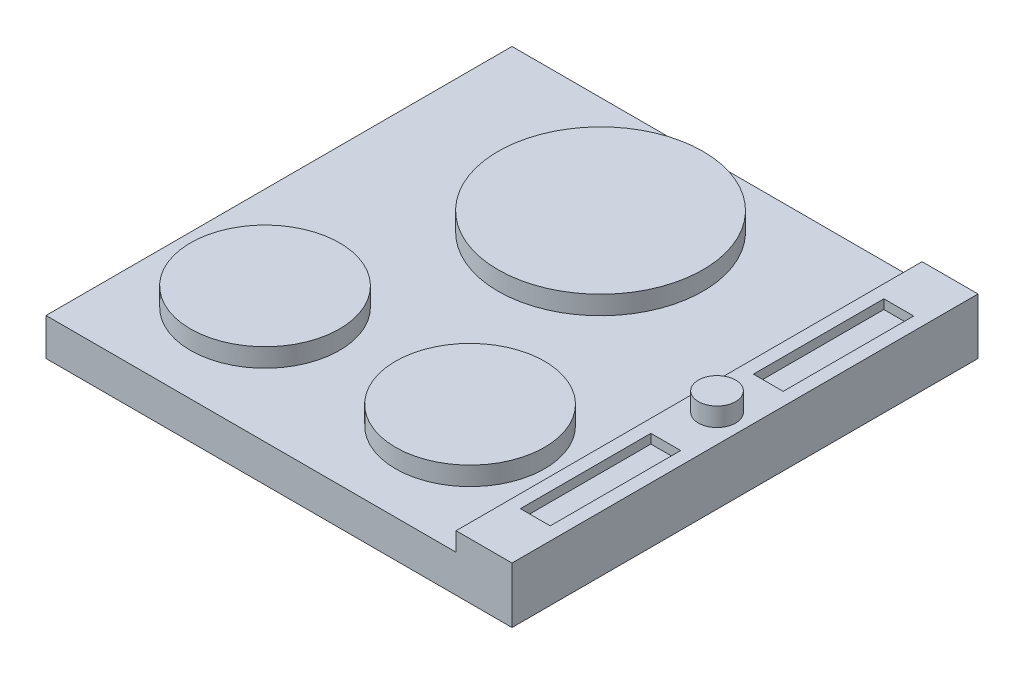
ISO-10303-21;
HEADER;
FILE_DESCRIPTION(('STEP AP214'),'2;1');
FILE_NAME('part.step','',(''),(''),'','','');
FILE_SCHEMA(('AUTOMOTIVE_DESIGN { 1 0 10303 214 1 1 1 1 }'));
ENDSEC;
DATA;
#1=APPLICATION_CONTEXT('core data for automotive mechanical design processes');
#2=APPLICATION_PROTOCOL_DEFINITION('international standard','automotive_design',2000,#1);
#3=PRODUCT_CONTEXT('',#1,'mechanical');
#4=PRODUCT('Part','Part','',(#3));
#5=PRODUCT_RELATED_PRODUCT_CATEGORY('part','',(#4));
#6=PRODUCT_DEFINITION_FORMATION('','',#4);
#7=PRODUCT_DEFINITION_CONTEXT('part definition',#1,'design');
#8=PRODUCT_DEFINITION('design','',#6,#7);
#9=PRODUCT_DEFINITION_SHAPE('','',#8);
#10=(LENGTH_UNIT() NAMED_UNIT(*) SI_UNIT(.MILLI.,.METRE.));
#11=(NAMED_UNIT(*) PLANE_ANGLE_UNIT() SI_UNIT($,.RADIAN.));
#12=(NAMED_UNIT(*) SI_UNIT($,.STERADIAN.) SOLID_ANGLE_UNIT());
#13=UNCERTAINTY_MEASURE_WITH_UNIT(LENGTH_MEASURE(1.E-05),#10,'distance_accuracy_value','');
#14=(GEOMETRIC_REPRESENTATION_CONTEXT(3) GLOBAL_UNCERTAINTY_ASSIGNED_CONTEXT((#13)) GLOBAL_UNIT_ASSIGNED_CONTEXT((#10,
#11,#12)) REPRESENTATION_CONTEXT('',''));
#15=CARTESIAN_POINT('',(0.,0.,0.));
#16=DIRECTION('',(0.,0.,1.));
#17=DIRECTION('',(1.,0.,0.));
#18=AXIS2_PLACEMENT_3D('',#15,#16,#17);
#19=CARTESIAN_POINT('',(-43.75,34.,34.));
#20=DIRECTION('',(1.,0.,0.));
#21=DIRECTION('',(0.,0.,-1.));
#22=AXIS2_PLACEMENT_3D('',#19,#20,#21);
#23=PLANE('',#22);
#24=DIRECTION('',(0.,0.,1.));
#25=VECTOR('',#24,1.);
#26=CARTESIAN_POINT('',(-43.75,32.,34.));
#27=LINE('',#26,#25);
#28=CARTESIAN_POINT('',(-43.75,32.,34.));
#29=VERTEX_POINT('',#28);
#30=CARTESIAN_POINT('',(-43.75,32.,59.));
#31=VERTEX_POINT('',#30);
#32=EDGE_CURVE('E246',#29,#31,#27,.T.);
#33=ORIENTED_EDGE('',*,*,#32,.T.);
#34=DIRECTION('',(0.,-1.,0.));
#35=VECTOR('',#34,1.);
#36=CARTESIAN_POINT('',(-43.75,34.,59.));
#37=LINE('',#36,#35);
#38=CARTESIAN_POINT('',(-43.75,34.,59.));
#39=VERTEX_POINT('',#38);
#40=EDGE_CURVE('E45',#39,#31,#37,.T.);
#41=ORIENTED_EDGE('',*,*,#40,.F.);
#42=DIRECTION('',(0.,0.,1.));
#43=VECTOR('',#42,1.);
#44=CARTESIAN_POINT('',(-43.75,34.,34.));
#45=LINE('',#44,#43);
#46=CARTESIAN_POINT('',(-43.75,34.,34.));
#47=VERTEX_POINT('',#46);
#48=EDGE_CURVE('E247',#47,#39,#45,.T.);
#49=ORIENTED_EDGE('',*,*,#48,.F.);
#50=DIRECTION('',(0.,-1.,0.));
#51=VECTOR('',#50,1.);
#52=CARTESIAN_POINT('',(-43.75,34.,34.));
#53=LINE('',#52,#51);
#54=EDGE_CURVE('E255',#47,#29,#53,.T.);
#55=ORIENTED_EDGE('',*,*,#54,.T.);
#56=EDGE_LOOP('',(#33,#41,#49,#55));
#57=FACE_BOUND('',#56,.T.);
#58=ADVANCED_FACE('F38',(#57),#23,.F.);
#59=CARTESIAN_POINT('',(-43.75,34.,59.));
#60=DIRECTION('',(0.,0.,-1.));
#61=DIRECTION('',(-1.,0.,0.));
#62=AXIS2_PLACEMENT_3D('',#59,#60,#61);
#63=PLANE('',#62);
#64=DIRECTION('',(1.,0.,0.));
#65=VECTOR('',#64,1.);
#66=CARTESIAN_POINT('',(-43.75,32.,59.));
#67=LINE('',#66,#65);
#68=CARTESIAN_POINT('',(-18.75,32.,59.));
#69=VERTEX_POINT('',#68);
#70=EDGE_CURVE('E258',#31,#69,#67,.T.);
#71=ORIENTED_EDGE('',*,*,#70,.T.);
#72=DIRECTION('',(0.,-1.,0.));
#73=VECTOR('',#72,1.);
#74=CARTESIAN_POINT('',(-18.75,34.,59.));
#75=LINE('',#74,#73);
#76=CARTESIAN_POINT('',(-18.75,35.,59.));
#77=VERTEX_POINT('',#76);
#78=EDGE_CURVE('E268',#77,#69,#75,.T.);
#79=ORIENTED_EDGE('',*,*,#78,.F.);
#80=DIRECTION('',(1.,0.,0.));
#81=VECTOR('',#80,1.);
#82=CARTESIAN_POINT('',(-18.75,35.,59.));
#83=LINE('',#82,#81);
#84=CARTESIAN_POINT('',(-21.75,35.,59.));
#85=VERTEX_POINT('',#84);
#86=EDGE_CURVE('E235',#85,#77,#83,.T.);
#87=ORIENTED_EDGE('',*,*,#86,.F.);
#88=DIRECTION('',(0.,-1.,0.));
#89=VECTOR('',#88,1.);
#90=CARTESIAN_POINT('',(-21.75,35.,59.));
#91=LINE('',#90,#89);
#92=CARTESIAN_POINT('',(-21.75,34.,59.));
#93=VERTEX_POINT('',#92);
#94=EDGE_CURVE('E238',#85,#93,#91,.T.);
#95=ORIENTED_EDGE('',*,*,#94,.T.);
#96=DIRECTION('',(1.,0.,0.));
#97=VECTOR('',#96,1.);
#98=CARTESIAN_POINT('',(-43.75,34.,59.));
#99=LINE('',#98,#97);
#100=EDGE_CURVE('E250',#39,#93,#99,.T.);
#101=ORIENTED_EDGE('',*,*,#100,.F.);
#102=ORIENTED_EDGE('',*,*,#40,.T.);
#103=EDGE_LOOP('',(#71,#79,#87,#95,#101,#102));
#104=FACE_BOUND('',#103,.T.);
#105=ADVANCED_FACE('F273',(#104),#63,.F.);
#106=CARTESIAN_POINT('',(-18.75,34.,34.));
#107=DIRECTION('',(-1.,0.,0.));
#108=DIRECTION('',(0.,0.,1.));
#109=AXIS2_PLACEMENT_3D('',#106,#107,#108);
#110=PLANE('',#109);
#111=DIRECTION('',(0.,0.,-1.));
#112=VECTOR('',#111,1.);
#113=CARTESIAN_POINT('',(-18.75,32.,34.));
#114=LINE('',#113,#112);
#115=CARTESIAN_POINT('',(-18.75,32.,34.));
#116=VERTEX_POINT('',#115);
#117=EDGE_CURVE('E260',#69,#116,#114,.T.);
#118=ORIENTED_EDGE('',*,*,#117,.T.);
#119=DIRECTION('',(0.,-1.,0.));
#120=VECTOR('',#119,1.);
#121=CARTESIAN_POINT('',(-18.75,34.,34.));
#122=LINE('',#121,#120);
#123=CARTESIAN_POINT('',(-18.75,35.,34.));
#124=VERTEX_POINT('',#123);
#125=EDGE_CURVE('E265',#124,#116,#122,.T.);
#126=ORIENTED_EDGE('',*,*,#125,.F.);
#127=DIRECTION('',(0.,0.,-1.));
#128=VECTOR('',#127,1.);
#129=CARTESIAN_POINT('',(-18.75,35.,34.));
#130=LINE('',#129,#128);
#131=EDGE_CURVE('E228',#77,#124,#130,.T.);
#132=ORIENTED_EDGE('',*,*,#131,.F.);
#133=ORIENTED_EDGE('',*,*,#78,.T.);
#134=EDGE_LOOP('',(#118,#126,#132,#133));
#135=FACE_BOUND('',#134,.T.);
#136=ADVANCED_FACE('F283',(#135),#110,.F.);
#137=CARTESIAN_POINT('',(-43.75,34.,34.));
#138=DIRECTION('',(0.,0.,1.));
#139=DIRECTION('',(1.,0.,0.));
#140=AXIS2_PLACEMENT_3D('',#137,#138,#139);
#141=PLANE('',#140);
#142=DIRECTION('',(-1.,0.,0.));
#143=VECTOR('',#142,1.);
#144=CARTESIAN_POINT('',(-43.75,32.,34.));
#145=LINE('',#144,#143);
#146=EDGE_CURVE('E251',#116,#29,#145,.T.);
#147=ORIENTED_EDGE('',*,*,#146,.T.);
#148=ORIENTED_EDGE('',*,*,#54,.F.);
#149=DIRECTION('',(-1.,0.,0.));
#150=VECTOR('',#149,1.);
#151=CARTESIAN_POINT('',(-43.75,34.,34.));
#152=LINE('',#151,#150);
#153=CARTESIAN_POINT('',(-21.75,34.,34.));
#154=VERTEX_POINT('',#153);
#155=EDGE_CURVE('E253',#154,#47,#152,.T.);
#156=ORIENTED_EDGE('',*,*,#155,.F.);
#157=DIRECTION('',(0.,-1.,0.));
#158=VECTOR('',#157,1.);
#159=CARTESIAN_POINT('',(-21.75,35.,34.));
#160=LINE('',#159,#158);
#161=CARTESIAN_POINT('',(-21.75,35.,34.));
#162=VERTEX_POINT('',#161);
#163=EDGE_CURVE('E243',#162,#154,#160,.T.);
#164=ORIENTED_EDGE('',*,*,#163,.F.);
#165=DIRECTION('',(-1.,0.,0.));
#166=VECTOR('',#165,1.);
#167=CARTESIAN_POINT('',(-18.75,35.,34.));
#168=LINE('',#167,#166);
#169=EDGE_CURVE('E231',#124,#162,#168,.T.);
#170=ORIENTED_EDGE('',*,*,#169,.F.);
#171=ORIENTED_EDGE('',*,*,#125,.T.);
#172=EDGE_LOOP('',(#147,#148,#156,#164,#170,#171));
#173=FACE_BOUND('',#172,.T.);
#174=ADVANCED_FACE('F287',(#173),#141,.F.);
#175=CARTESIAN_POINT('',(0.,34.,0.));
#176=DIRECTION('',(0.,1.,0.));
#177=DIRECTION('',(0.,0.,1.));
#178=AXIS2_PLACEMENT_3D('',#175,#176,#177);
#179=PLANE('',#178);
#180=CARTESIAN_POINT('',(-32.75,34.,40.25));
#181=DIRECTION('',(0.,1.,0.));
#182=DIRECTION('',(0.,0.,1.));
#183=AXIS2_PLACEMENT_3D('',#180,#181,#182);
#184=CIRCLE('',#183,5.5);
#185=CARTESIAN_POINT('',(-32.75,34.,45.75));
#186=VERTEX_POINT('',#185);
#187=EDGE_CURVE('E210',#186,#186,#184,.T.);
#188=ORIENTED_EDGE('',*,*,#187,.F.);
#189=EDGE_LOOP('',(#188));
#190=FACE_BOUND('',#189,.T.);
#191=CARTESIAN_POINT('',(-27.25,34.,52.75));
#192=DIRECTION('',(0.,1.,0.));
#193=DIRECTION('',(0.,0.,1.));
#194=AXIS2_PLACEMENT_3D('',#191,#192,#193);
#195=CIRCLE('',#194,4.);
#196=CARTESIAN_POINT('',(-27.25,34.,56.75));
#197=VERTEX_POINT('',#196);
#198=EDGE_CURVE('E216',#197,#197,#195,.T.);
#199=ORIENTED_EDGE('',*,*,#198,.F.);
#200=EDGE_LOOP('',(#199));
#201=FACE_BOUND('',#200,.T.);
#202=CARTESIAN_POINT('',(-38.25,34.,52.75));
#203=DIRECTION('',(0.,1.,0.));
#204=DIRECTION('',(0.,0.,1.));
#205=AXIS2_PLACEMENT_3D('',#202,#203,#204);
#206=CIRCLE('',#205,4.);
#207=CARTESIAN_POINT('',(-38.25,34.,56.75));
#208=VERTEX_POINT('',#207);
#209=EDGE_CURVE('E219',#208,#208,#206,.T.);
#210=ORIENTED_EDGE('',*,*,#209,.F.);
#211=EDGE_LOOP('',(#210));
#212=FACE_BOUND('',#211,.T.);
#213=DIRECTION('',(0.,0.,1.));
#214=VECTOR('',#213,1.);
#215=CARTESIAN_POINT('',(-21.75,34.,34.));
#216=LINE('',#215,#214);
#217=EDGE_CURVE('E225',#154,#93,#216,.T.);
#218=ORIENTED_EDGE('',*,*,#217,.F.);
#219=ORIENTED_EDGE('',*,*,#155,.T.);
#220=ORIENTED_EDGE('',*,*,#48,.T.);
#221=ORIENTED_EDGE('',*,*,#100,.T.);
#222=EDGE_LOOP('',(#218,#219,#220,#221));
#223=FACE_BOUND('',#222,.T.);
#224=ADVANCED_FACE('F298',(#190,#201,#212,#223),#179,.T.);
#225=CARTESIAN_POINT('',(0.,32.,0.));
#226=DIRECTION('',(0.,1.,0.));
#227=DIRECTION('',(0.,0.,1.));
#228=AXIS2_PLACEMENT_3D('',#225,#226,#227);
#229=PLANE('',#228);
#230=ORIENTED_EDGE('',*,*,#32,.F.);
#231=ORIENTED_EDGE('',*,*,#146,.F.);
#232=ORIENTED_EDGE('',*,*,#117,.F.);
#233=ORIENTED_EDGE('',*,*,#70,.F.);
#234=EDGE_LOOP('',(#230,#231,#232,#233));
#235=FACE_BOUND('',#234,.T.);
#236=ADVANCED_FACE('F280',(#235),#229,.F.);
#237=CARTESIAN_POINT('',(-21.75,35.,34.));
#238=DIRECTION('',(1.,0.,0.));
#239=DIRECTION('',(0.,0.,-1.));
#240=AXIS2_PLACEMENT_3D('',#237,#238,#239);
#241=PLANE('',#240);
#242=ORIENTED_EDGE('',*,*,#217,.T.);
#243=ORIENTED_EDGE('',*,*,#94,.F.);
#244=DIRECTION('',(0.,0.,1.));
#245=VECTOR('',#244,1.);
#246=CARTESIAN_POINT('',(-21.75,35.,34.));
#247=LINE('',#246,#245);
#248=EDGE_CURVE('E233',#162,#85,#247,.T.);
#249=ORIENTED_EDGE('',*,*,#248,.F.);
#250=ORIENTED_EDGE('',*,*,#163,.T.);
#251=EDGE_LOOP('',(#242,#243,#249,#250));
#252=FACE_BOUND('',#251,.T.);
#253=ADVANCED_FACE('F296',(#252),#241,.F.);
#254=CARTESIAN_POINT('',(0.,35.,0.));
#255=DIRECTION('',(0.,-1.,0.));
#256=DIRECTION('',(0.,0.,-1.));
#257=AXIS2_PLACEMENT_3D('',#254,#255,#256);
#258=PLANE('',#257);
#259=DIRECTION('',(1.,0.,0.));
#260=VECTOR('',#259,1.);
#261=CARTESIAN_POINT('',(-21.05,35.,56.25));
#262=LINE('',#261,#260);
#263=CARTESIAN_POINT('',(-21.05,35.,56.25));
#264=VERTEX_POINT('',#263);
#265=CARTESIAN_POINT('',(-19.45,35.,56.25));
#266=VERTEX_POINT('',#265);
#267=EDGE_CURVE('E167',#264,#266,#262,.T.);
#268=ORIENTED_EDGE('',*,*,#267,.F.);
#269=DIRECTION('',(0.,0.,1.));
#270=VECTOR('',#269,1.);
#271=CARTESIAN_POINT('',(-21.05,35.,56.25));
#272=LINE('',#271,#270);
#273=CARTESIAN_POINT('',(-21.05,35.,49.25));
#274=VERTEX_POINT('',#273);
#275=EDGE_CURVE('E52',#274,#264,#272,.T.);
#276=ORIENTED_EDGE('',*,*,#275,.F.);
#277=DIRECTION('',(-1.,0.,0.));
#278=VECTOR('',#277,1.);
#279=CARTESIAN_POINT('',(-21.05,35.,49.25));
#280=LINE('',#279,#278);
#281=CARTESIAN_POINT('',(-19.45,35.,49.25));
#282=VERTEX_POINT('',#281);
#283=EDGE_CURVE('E158',#282,#274,#280,.T.);
#284=ORIENTED_EDGE('',*,*,#283,.F.);
#285=DIRECTION('',(0.,0.,-1.));
#286=VECTOR('',#285,1.);
#287=CARTESIAN_POINT('',(-19.45,35.,56.25));
#288=LINE('',#287,#286);
#289=EDGE_CURVE('E161',#266,#282,#288,.T.);
#290=ORIENTED_EDGE('',*,*,#289,.F.);
#291=EDGE_LOOP('',(#268,#276,#284,#290));
#292=FACE_BOUND('',#291,.T.);
#293=DIRECTION('',(0.,0.,1.));
#294=VECTOR('',#293,1.);
#295=CARTESIAN_POINT('',(-21.05,35.,36.75));
#296=LINE('',#295,#294);
#297=CARTESIAN_POINT('',(-21.05,35.,36.75));
#298=VERTEX_POINT('',#297);
#299=CARTESIAN_POINT('',(-21.05,35.,43.75));
#300=VERTEX_POINT('',#299);
#301=EDGE_CURVE('E193',#298,#300,#296,.T.);
#302=ORIENTED_EDGE('',*,*,#301,.F.);
#303=DIRECTION('',(-1.,0.,0.));
#304=VECTOR('',#303,1.);
#305=CARTESIAN_POINT('',(-21.05,35.,36.75));
#306=LINE('',#305,#304);
#307=CARTESIAN_POINT('',(-19.45,35.,36.75));
#308=VERTEX_POINT('',#307);
#309=EDGE_CURVE('E60',#308,#298,#306,.T.);
#310=ORIENTED_EDGE('',*,*,#309,.F.);
#311=DIRECTION('',(0.,0.,-1.));
#312=VECTOR('',#311,1.);
#313=CARTESIAN_POINT('',(-19.45,35.,36.75));
#314=LINE('',#313,#312);
#315=CARTESIAN_POINT('',(-19.45,35.,43.75));
#316=VERTEX_POINT('',#315);
#317=EDGE_CURVE('E186',#316,#308,#314,.T.);
#318=ORIENTED_EDGE('',*,*,#317,.F.);
#319=DIRECTION('',(1.,0.,0.));
#320=VECTOR('',#319,1.);
#321=CARTESIAN_POINT('',(-21.05,35.,43.75));
#322=LINE('',#321,#320);
#323=EDGE_CURVE('E189',#300,#316,#322,.T.);
#324=ORIENTED_EDGE('',*,*,#323,.F.);
#325=EDGE_LOOP('',(#302,#310,#318,#324));
#326=FACE_BOUND('',#325,.T.);
#327=CARTESIAN_POINT('',(-20.25,35.,46.5));
#328=DIRECTION('',(0.,-1.,0.));
#329=DIRECTION('',(0.,0.,-1.));
#330=AXIS2_PLACEMENT_3D('',#327,#328,#329);
#331=CIRCLE('',#330,1.);
#332=CARTESIAN_POINT('',(-20.25,35.,45.5));
#333=VERTEX_POINT('',#332);
#334=EDGE_CURVE('E11',#333,#333,#331,.F.);
#335=ORIENTED_EDGE('',*,*,#334,.F.);
#336=EDGE_LOOP('',(#335));
#337=FACE_BOUND('',#336,.T.);
#338=ORIENTED_EDGE('',*,*,#131,.T.);
#339=ORIENTED_EDGE('',*,*,#169,.T.);
#340=ORIENTED_EDGE('',*,*,#248,.T.);
#341=ORIENTED_EDGE('',*,*,#86,.T.);
#342=EDGE_LOOP('',(#338,#339,#340,#341));
#343=FACE_BOUND('',#342,.T.);
#344=ADVANCED_FACE('F292',(#292,#326,#337,#343),#258,.F.);
#345=CARTESIAN_POINT('',(-38.25,35.,52.75));
#346=DIRECTION('',(0.,-1.,0.));
#347=DIRECTION('',(0.,0.,-1.));
#348=AXIS2_PLACEMENT_3D('',#345,#346,#347);
#349=CYLINDRICAL_SURFACE('',#348,4.);
#350=CARTESIAN_POINT('',(-38.25,35.,52.75));
#351=DIRECTION('',(0.,1.,0.));
#352=DIRECTION('',(0.,0.,1.));
#353=AXIS2_PLACEMENT_3D('',#350,#351,#352);
#354=CIRCLE('',#353,4.);
#355=CARTESIAN_POINT('',(-38.25,35.,56.75));
#356=VERTEX_POINT('',#355);
#357=EDGE_CURVE('E222',#356,#356,#354,.T.);
#358=ORIENTED_EDGE('',*,*,#357,.F.);
#359=EDGE_LOOP('',(#358));
#360=FACE_BOUND('',#359,.T.);
#361=ORIENTED_EDGE('',*,*,#209,.T.);
#362=EDGE_LOOP('',(#361));
#363=FACE_BOUND('',#362,.T.);
#364=ADVANCED_FACE('F360',(#360,#363),#349,.T.);
#365=CARTESIAN_POINT('',(-38.25,35.,52.75));
#366=DIRECTION('',(0.,1.,0.));
#367=DIRECTION('',(0.,0.,1.));
#368=AXIS2_PLACEMENT_3D('',#365,#366,#367);
#369=PLANE('',#368);
#370=ORIENTED_EDGE('',*,*,#357,.T.);
#371=EDGE_LOOP('',(#370));
#372=FACE_BOUND('',#371,.T.);
#373=ADVANCED_FACE('F372',(#372),#369,.T.);
#374=CARTESIAN_POINT('',(-27.25,35.,52.75));
#375=DIRECTION('',(0.,-1.,0.));
#376=DIRECTION('',(0.,0.,-1.));
#377=AXIS2_PLACEMENT_3D('',#374,#375,#376);
#378=CYLINDRICAL_SURFACE('',#377,4.);
#379=CARTESIAN_POINT('',(-27.25,35.,52.75));
#380=DIRECTION('',(0.,1.,0.));
#381=DIRECTION('',(0.,0.,1.));
#382=AXIS2_PLACEMENT_3D('',#379,#380,#381);
#383=CIRCLE('',#382,4.);
#384=CARTESIAN_POINT('',(-27.25,35.,56.75));
#385=VERTEX_POINT('',#384);
#386=EDGE_CURVE('E213',#385,#385,#383,.T.);
#387=ORIENTED_EDGE('',*,*,#386,.F.);
#388=EDGE_LOOP('',(#387));
#389=FACE_BOUND('',#388,.T.);
#390=ORIENTED_EDGE('',*,*,#198,.T.);
#391=EDGE_LOOP('',(#390));
#392=FACE_BOUND('',#391,.T.);
#393=ADVANCED_FACE('F383',(#389,#392),#378,.T.);
#394=CARTESIAN_POINT('',(-27.25,35.,52.75));
#395=DIRECTION('',(0.,1.,0.));
#396=DIRECTION('',(0.,0.,1.));
#397=AXIS2_PLACEMENT_3D('',#394,#395,#396);
#398=PLANE('',#397);
#399=ORIENTED_EDGE('',*,*,#386,.T.);
#400=EDGE_LOOP('',(#399));
#401=FACE_BOUND('',#400,.T.);
#402=ADVANCED_FACE('F394',(#401),#398,.T.);
#403=CARTESIAN_POINT('',(-32.75,35.,40.25));
#404=DIRECTION('',(0.,-1.,0.));
#405=DIRECTION('',(0.,0.,-1.));
#406=AXIS2_PLACEMENT_3D('',#403,#404,#405);
#407=CYLINDRICAL_SURFACE('',#406,5.5);
#408=CARTESIAN_POINT('',(-32.75,35.,40.25));
#409=DIRECTION('',(0.,1.,0.));
#410=DIRECTION('',(0.,0.,1.));
#411=AXIS2_PLACEMENT_3D('',#408,#409,#410);
#412=CIRCLE('',#411,5.5);
#413=CARTESIAN_POINT('',(-32.75,35.,45.75));
#414=VERTEX_POINT('',#413);
#415=EDGE_CURVE('E209',#414,#414,#412,.T.);
#416=ORIENTED_EDGE('',*,*,#415,.F.);
#417=EDGE_LOOP('',(#416));
#418=FACE_BOUND('',#417,.T.);
#419=ORIENTED_EDGE('',*,*,#187,.T.);
#420=EDGE_LOOP('',(#419));
#421=FACE_BOUND('',#420,.T.);
#422=ADVANCED_FACE('F405',(#418,#421),#407,.T.);
#423=CARTESIAN_POINT('',(-32.75,35.,40.25));
#424=DIRECTION('',(0.,1.,0.));
#425=DIRECTION('',(0.,0.,1.));
#426=AXIS2_PLACEMENT_3D('',#423,#424,#425);
#427=PLANE('',#426);
#428=ORIENTED_EDGE('',*,*,#415,.T.);
#429=EDGE_LOOP('',(#428));
#430=FACE_BOUND('',#429,.T.);
#431=ADVANCED_FACE('F416',(#430),#427,.T.);
#432=CARTESIAN_POINT('',(-20.25,36.,46.5));
#433=DIRECTION('',(0.,-1.,0.));
#434=DIRECTION('',(0.,0.,-1.));
#435=AXIS2_PLACEMENT_3D('',#432,#433,#434);
#436=CYLINDRICAL_SURFACE('',#435,1.);
#437=CARTESIAN_POINT('',(-20.25,36.,46.5));
#438=DIRECTION('',(0.,1.,0.));
#439=DIRECTION('',(0.,0.,1.));
#440=AXIS2_PLACEMENT_3D('',#437,#438,#439);
#441=CIRCLE('',#440,1.);
#442=CARTESIAN_POINT('',(-20.25,36.,47.5));
#443=VERTEX_POINT('',#442);
#444=EDGE_CURVE('E173',#443,#443,#441,.T.);
#445=ORIENTED_EDGE('',*,*,#444,.F.);
#446=EDGE_LOOP('',(#445));
#447=FACE_BOUND('',#446,.T.);
#448=ORIENTED_EDGE('',*,*,#334,.T.);
#449=EDGE_LOOP('',(#448));
#450=FACE_BOUND('',#449,.T.);
#451=ADVANCED_FACE('F427',(#447,#450),#436,.T.);
#452=CARTESIAN_POINT('',(-20.25,36.,46.5));
#453=DIRECTION('',(0.,1.,0.));
#454=DIRECTION('',(0.,0.,1.));
#455=AXIS2_PLACEMENT_3D('',#452,#453,#454);
#456=PLANE('',#455);
#457=ORIENTED_EDGE('',*,*,#444,.T.);
#458=EDGE_LOOP('',(#457));
#459=FACE_BOUND('',#458,.T.);
#460=ADVANCED_FACE('F438',(#459),#456,.T.);
#461=CARTESIAN_POINT('',(-21.05,34.5,36.75));
#462=DIRECTION('',(0.,0.,-1.));
#463=DIRECTION('',(-1.,0.,0.));
#464=AXIS2_PLACEMENT_3D('',#461,#462,#463);
#465=PLANE('',#464);
#466=ORIENTED_EDGE('',*,*,#309,.T.);
#467=DIRECTION('',(0.,1.,0.));
#468=VECTOR('',#467,1.);
#469=CARTESIAN_POINT('',(-21.05,34.5,36.75));
#470=LINE('',#469,#468);
#471=CARTESIAN_POINT('',(-21.05,34.5,36.75));
#472=VERTEX_POINT('',#471);
#473=EDGE_CURVE('E177',#472,#298,#470,.T.);
#474=ORIENTED_EDGE('',*,*,#473,.F.);
#475=DIRECTION('',(-1.,0.,0.));
#476=VECTOR('',#475,1.);
#477=CARTESIAN_POINT('',(-21.05,34.5,36.75));
#478=LINE('',#477,#476);
#479=CARTESIAN_POINT('',(-19.45,34.5,36.75));
#480=VERTEX_POINT('',#479);
#481=EDGE_CURVE('E190',#480,#472,#478,.T.);
#482=ORIENTED_EDGE('',*,*,#481,.F.);
#483=DIRECTION('',(0.,1.,0.));
#484=VECTOR('',#483,1.);
#485=CARTESIAN_POINT('',(-19.45,34.5,36.75));
#486=LINE('',#485,#484);
#487=EDGE_CURVE('E184',#480,#308,#486,.T.);
#488=ORIENTED_EDGE('',*,*,#487,.T.);
#489=EDGE_LOOP('',(#466,#474,#482,#488));
#490=FACE_BOUND('',#489,.T.);
#491=ADVANCED_FACE('F448',(#490),#465,.F.);
#492=CARTESIAN_POINT('',(-19.45,34.5,36.75));
#493=DIRECTION('',(1.,0.,0.));
#494=DIRECTION('',(0.,0.,-1.));
#495=AXIS2_PLACEMENT_3D('',#492,#493,#494);
#496=PLANE('',#495);
#497=ORIENTED_EDGE('',*,*,#317,.T.);
#498=ORIENTED_EDGE('',*,*,#487,.F.);
#499=DIRECTION('',(0.,0.,-1.));
#500=VECTOR('',#499,1.);
#501=CARTESIAN_POINT('',(-19.45,34.5,36.75));
#502=LINE('',#501,#500);
#503=CARTESIAN_POINT('',(-19.45,34.5,43.75));
#504=VERTEX_POINT('',#503);
#505=EDGE_CURVE('E179',#504,#480,#502,.T.);
#506=ORIENTED_EDGE('',*,*,#505,.F.);
#507=DIRECTION('',(0.,1.,0.));
#508=VECTOR('',#507,1.);
#509=CARTESIAN_POINT('',(-19.45,34.5,43.75));
#510=LINE('',#509,#508);
#511=EDGE_CURVE('E182',#504,#316,#510,.T.);
#512=ORIENTED_EDGE('',*,*,#511,.T.);
#513=EDGE_LOOP('',(#497,#498,#506,#512));
#514=FACE_BOUND('',#513,.T.);
#515=ADVANCED_FACE('F458',(#514),#496,.F.);
#516=CARTESIAN_POINT('',(-21.05,34.5,43.75));
#517=DIRECTION('',(0.,0.,1.));
#518=DIRECTION('',(1.,0.,0.));
#519=AXIS2_PLACEMENT_3D('',#516,#517,#518);
#520=PLANE('',#519);
#521=ORIENTED_EDGE('',*,*,#323,.T.);
#522=ORIENTED_EDGE('',*,*,#511,.F.);
#523=DIRECTION('',(1.,0.,0.));
#524=VECTOR('',#523,1.);
#525=CARTESIAN_POINT('',(-21.05,34.5,43.75));
#526=LINE('',#525,#524);
#527=CARTESIAN_POINT('',(-21.05,34.5,43.75));
#528=VERTEX_POINT('',#527);
#529=EDGE_CURVE('E199',#528,#504,#526,.T.);
#530=ORIENTED_EDGE('',*,*,#529,.F.);
#531=DIRECTION('',(0.,1.,0.));
#532=VECTOR('',#531,1.);
#533=CARTESIAN_POINT('',(-21.05,34.5,43.75));
#534=LINE('',#533,#532);
#535=EDGE_CURVE('E180',#528,#300,#534,.T.);
#536=ORIENTED_EDGE('',*,*,#535,.T.);
#537=EDGE_LOOP('',(#521,#522,#530,#536));
#538=FACE_BOUND('',#537,.T.);
#539=ADVANCED_FACE('F468',(#538),#520,.F.);
#540=CARTESIAN_POINT('',(-21.05,34.5,36.75));
#541=DIRECTION('',(-1.,0.,0.));
#542=DIRECTION('',(0.,0.,1.));
#543=AXIS2_PLACEMENT_3D('',#540,#541,#542);
#544=PLANE('',#543);
#545=ORIENTED_EDGE('',*,*,#301,.T.);
#546=ORIENTED_EDGE('',*,*,#535,.F.);
#547=DIRECTION('',(0.,0.,1.));
#548=VECTOR('',#547,1.);
#549=CARTESIAN_POINT('',(-21.05,34.5,36.75));
#550=LINE('',#549,#548);
#551=EDGE_CURVE('E202',#472,#528,#550,.T.);
#552=ORIENTED_EDGE('',*,*,#551,.F.);
#553=ORIENTED_EDGE('',*,*,#473,.T.);
#554=EDGE_LOOP('',(#545,#546,#552,#553));
#555=FACE_BOUND('',#554,.T.);
#556=ADVANCED_FACE('F479',(#555),#544,.F.);
#557=CARTESIAN_POINT('',(0.,34.5,0.));
#558=DIRECTION('',(0.,-1.,0.));
#559=DIRECTION('',(0.,0.,-1.));
#560=AXIS2_PLACEMENT_3D('',#557,#558,#559);
#561=PLANE('',#560);
#562=ORIENTED_EDGE('',*,*,#481,.T.);
#563=ORIENTED_EDGE('',*,*,#551,.T.);
#564=ORIENTED_EDGE('',*,*,#529,.T.);
#565=ORIENTED_EDGE('',*,*,#505,.T.);
#566=EDGE_LOOP('',(#562,#563,#564,#565));
#567=FACE_BOUND('',#566,.T.);
#568=ADVANCED_FACE('F490',(#567),#561,.F.);
#569=CARTESIAN_POINT('',(-21.05,34.5,56.25));
#570=DIRECTION('',(-1.,0.,0.));
#571=DIRECTION('',(0.,0.,1.));
#572=AXIS2_PLACEMENT_3D('',#569,#570,#571);
#573=PLANE('',#572);
#574=ORIENTED_EDGE('',*,*,#275,.T.);
#575=DIRECTION('',(0.,1.,0.));
#576=VECTOR('',#575,1.);
#577=CARTESIAN_POINT('',(-21.05,34.5,56.25));
#578=LINE('',#577,#576);
#579=CARTESIAN_POINT('',(-21.05,34.5,56.25));
#580=VERTEX_POINT('',#579);
#581=EDGE_CURVE('E136',#580,#264,#578,.T.);
#582=ORIENTED_EDGE('',*,*,#581,.F.);
#583=DIRECTION('',(0.,0.,1.));
#584=VECTOR('',#583,1.);
#585=CARTESIAN_POINT('',(-21.05,34.5,56.25));
#586=LINE('',#585,#584);
#587=CARTESIAN_POINT('',(-21.05,34.5,49.25));
#588=VERTEX_POINT('',#587);
#589=EDGE_CURVE('E140',#588,#580,#586,.T.);
#590=ORIENTED_EDGE('',*,*,#589,.F.);
#591=DIRECTION('',(0.,1.,0.));
#592=VECTOR('',#591,1.);
#593=CARTESIAN_POINT('',(-21.05,34.5,49.25));
#594=LINE('',#593,#592);
#595=EDGE_CURVE('E171',#588,#274,#594,.T.);
#596=ORIENTED_EDGE('',*,*,#595,.T.);
#597=EDGE_LOOP('',(#574,#582,#590,#596));
#598=FACE_BOUND('',#597,.T.);
#599=ADVANCED_FACE('F138',(#598),#573,.F.);
#600=CARTESIAN_POINT('',(-21.05,34.5,49.25));
#601=DIRECTION('',(0.,0.,-1.));
#602=DIRECTION('',(-1.,0.,0.));
#603=AXIS2_PLACEMENT_3D('',#600,#601,#602);
#604=PLANE('',#603);
#605=ORIENTED_EDGE('',*,*,#283,.T.);
#606=ORIENTED_EDGE('',*,*,#595,.F.);
#607=DIRECTION('',(-1.,0.,0.));
#608=VECTOR('',#607,1.);
#609=CARTESIAN_POINT('',(-21.05,34.5,49.25));
#610=LINE('',#609,#608);
#611=CARTESIAN_POINT('',(-19.45,34.5,49.25));
#612=VERTEX_POINT('',#611);
#613=EDGE_CURVE('E146',#612,#588,#610,.T.);
#614=ORIENTED_EDGE('',*,*,#613,.F.);
#615=DIRECTION('',(0.,1.,0.));
#616=VECTOR('',#615,1.);
#617=CARTESIAN_POINT('',(-19.45,34.5,49.25));
#618=LINE('',#617,#616);
#619=EDGE_CURVE('E174',#612,#282,#618,.T.);
#620=ORIENTED_EDGE('',*,*,#619,.T.);
#621=EDGE_LOOP('',(#605,#606,#614,#620));
#622=FACE_BOUND('',#621,.T.);
#623=ADVANCED_FACE('F511',(#622),#604,.F.);
#624=CARTESIAN_POINT('',(-19.45,34.5,56.25));
#625=DIRECTION('',(1.,0.,0.));
#626=DIRECTION('',(0.,0.,-1.));
#627=AXIS2_PLACEMENT_3D('',#624,#625,#626);
#628=PLANE('',#627);
#629=ORIENTED_EDGE('',*,*,#289,.T.);
#630=ORIENTED_EDGE('',*,*,#619,.F.);
#631=DIRECTION('',(0.,0.,-1.));
#632=VECTOR('',#631,1.);
#633=CARTESIAN_POINT('',(-19.45,34.5,56.25));
#634=LINE('',#633,#632);
#635=CARTESIAN_POINT('',(-19.45,34.5,56.25));
#636=VERTEX_POINT('',#635);
#637=EDGE_CURVE('E154',#636,#612,#634,.T.);
#638=ORIENTED_EDGE('',*,*,#637,.F.);
#639=DIRECTION('',(0.,1.,0.));
#640=VECTOR('',#639,1.);
#641=CARTESIAN_POINT('',(-19.45,34.5,56.25));
#642=LINE('',#641,#640);
#643=EDGE_CURVE('E145',#636,#266,#642,.T.);
#644=ORIENTED_EDGE('',*,*,#643,.T.);
#645=EDGE_LOOP('',(#629,#630,#638,#644));
#646=FACE_BOUND('',#645,.T.);
#647=ADVANCED_FACE('F521',(#646),#628,.F.);
#648=CARTESIAN_POINT('',(-21.05,34.5,56.25));
#649=DIRECTION('',(0.,0.,1.));
#650=DIRECTION('',(1.,0.,0.));
#651=AXIS2_PLACEMENT_3D('',#648,#649,#650);
#652=PLANE('',#651);
#653=ORIENTED_EDGE('',*,*,#267,.T.);
#654=ORIENTED_EDGE('',*,*,#643,.F.);
#655=DIRECTION('',(1.,0.,0.));
#656=VECTOR('',#655,1.);
#657=CARTESIAN_POINT('',(-21.05,34.5,56.25));
#658=LINE('',#657,#656);
#659=EDGE_CURVE('E149',#580,#636,#658,.T.);
#660=ORIENTED_EDGE('',*,*,#659,.F.);
#661=ORIENTED_EDGE('',*,*,#581,.T.);
#662=EDGE_LOOP('',(#653,#654,#660,#661));
#663=FACE_BOUND('',#662,.T.);
#664=ADVANCED_FACE('F150',(#663),#652,.F.);
#665=CARTESIAN_POINT('',(0.,34.5,0.));
#666=DIRECTION('',(0.,-1.,0.));
#667=DIRECTION('',(0.,0.,-1.));
#668=AXIS2_PLACEMENT_3D('',#665,#666,#667);
#669=PLANE('',#668);
#670=ORIENTED_EDGE('',*,*,#589,.T.);
#671=ORIENTED_EDGE('',*,*,#659,.T.);
#672=ORIENTED_EDGE('',*,*,#637,.T.);
#673=ORIENTED_EDGE('',*,*,#613,.T.);
#674=EDGE_LOOP('',(#670,#671,#672,#673));
#675=FACE_BOUND('',#674,.T.);
#676=ADVANCED_FACE('F156',(#675),#669,.F.);
#677=CLOSED_SHELL('',(#58,#105,#136,#174,#224,#236,#253,#344,#364,#373,#393,#402,#422,#431,#451,
#460,#491,#515,#539,#556,#568,#599,#623,#647,#664,#676));
#678=MANIFOLD_SOLID_BREP('B2',#677);
#679=ADVANCED_BREP_SHAPE_REPRESENTATION('',(#18,#678),#14);
#680=SHAPE_DEFINITION_REPRESENTATION(#9,#679);
ENDSEC;
END-ISO-10303-21;
